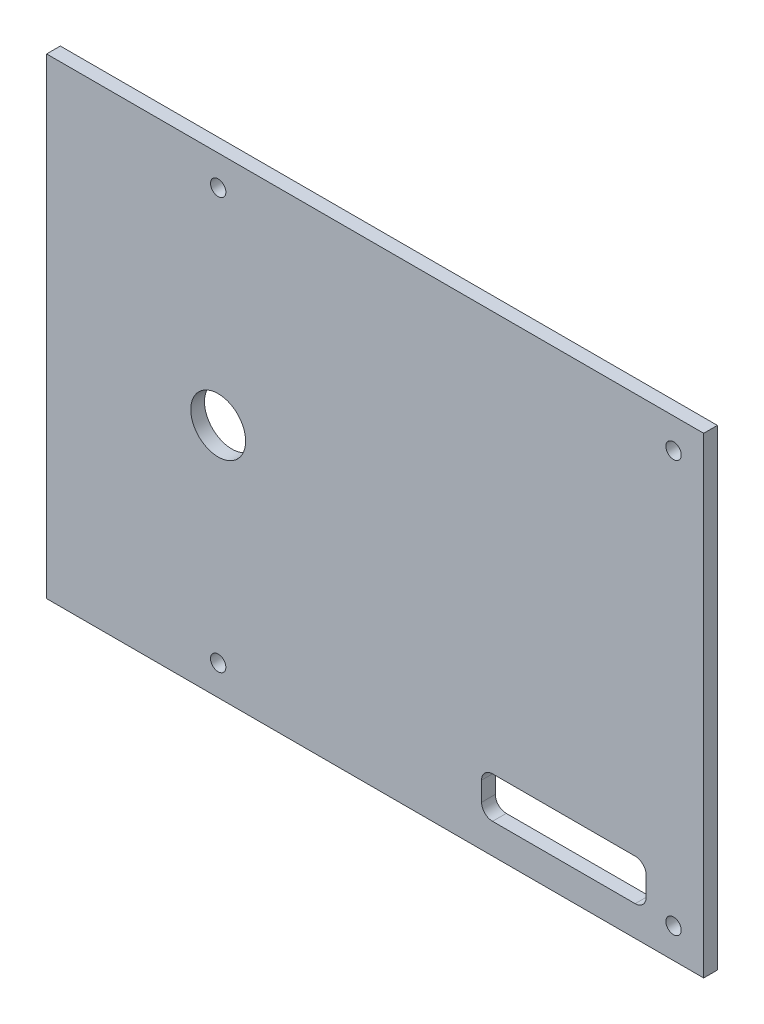
ISO-10303-21;
HEADER;
FILE_DESCRIPTION(('STEP AP214'),'2;1');
FILE_NAME('part.step','',(''),(''),'','','');
FILE_SCHEMA(('AUTOMOTIVE_DESIGN { 1 0 10303 214 1 1 1 1 }'));
ENDSEC;
DATA;
#1=APPLICATION_CONTEXT('core data for automotive mechanical design processes');
#2=APPLICATION_PROTOCOL_DEFINITION('international standard','automotive_design',2000,#1);
#3=PRODUCT_CONTEXT('',#1,'mechanical');
#4=PRODUCT('Part','Part','',(#3));
#5=PRODUCT_RELATED_PRODUCT_CATEGORY('part','',(#4));
#6=PRODUCT_DEFINITION_FORMATION('','',#4);
#7=PRODUCT_DEFINITION_CONTEXT('part definition',#1,'design');
#8=PRODUCT_DEFINITION('design','',#6,#7);
#9=PRODUCT_DEFINITION_SHAPE('','',#8);
#10=(LENGTH_UNIT() NAMED_UNIT(*) SI_UNIT(.MILLI.,.METRE.));
#11=(NAMED_UNIT(*) PLANE_ANGLE_UNIT() SI_UNIT($,.RADIAN.));
#12=(NAMED_UNIT(*) SI_UNIT($,.STERADIAN.) SOLID_ANGLE_UNIT());
#13=UNCERTAINTY_MEASURE_WITH_UNIT(LENGTH_MEASURE(1.E-05),#10,'distance_accuracy_value','');
#14=(GEOMETRIC_REPRESENTATION_CONTEXT(3) GLOBAL_UNCERTAINTY_ASSIGNED_CONTEXT((#13)) GLOBAL_UNIT_ASSIGNED_CONTEXT((#10,
#11,#12)) REPRESENTATION_CONTEXT('',''));
#15=CARTESIAN_POINT('',(0.,0.,0.));
#16=DIRECTION('',(0.,0.,1.));
#17=DIRECTION('',(1.,0.,0.));
#18=AXIS2_PLACEMENT_3D('',#15,#16,#17);
#19=CARTESIAN_POINT('',(-14.7875,54.61,3.175));
#20=DIRECTION('',(0.,1.,0.));
#21=DIRECTION('',(0.,0.,1.));
#22=AXIS2_PLACEMENT_3D('',#19,#20,#21);
#23=PLANE('',#22);
#24=DIRECTION('',(1.,0.,0.));
#25=VECTOR('',#24,1.);
#26=CARTESIAN_POINT('',(-14.7875,54.61,0.));
#27=LINE('',#26,#25);
#28=CARTESIAN_POINT('',(-92.44,54.61,0.));
#29=VERTEX_POINT('',#28);
#30=CARTESIAN_POINT('',(59.69,54.61,0.));
#31=VERTEX_POINT('',#30);
#32=EDGE_CURVE('E136',#29,#31,#27,.T.);
#33=ORIENTED_EDGE('',*,*,#32,.F.);
#34=DIRECTION('',(0.,0.,-1.));
#35=VECTOR('',#34,1.);
#36=CARTESIAN_POINT('',(-92.44,54.61,0.));
#37=LINE('',#36,#35);
#38=CARTESIAN_POINT('',(-92.44,54.61,3.175));
#39=VERTEX_POINT('',#38);
#40=EDGE_CURVE('E151',#39,#29,#37,.T.);
#41=ORIENTED_EDGE('',*,*,#40,.F.);
#42=DIRECTION('',(1.,0.,0.));
#43=VECTOR('',#42,1.);
#44=CARTESIAN_POINT('',(-14.7875,54.61,3.175));
#45=LINE('',#44,#43);
#46=CARTESIAN_POINT('',(59.69,54.61,3.175));
#47=VERTEX_POINT('',#46);
#48=EDGE_CURVE('E187',#39,#47,#45,.T.);
#49=ORIENTED_EDGE('',*,*,#48,.T.);
#50=DIRECTION('',(0.,0.,-1.));
#51=VECTOR('',#50,1.);
#52=CARTESIAN_POINT('',(59.69,54.61,3.175));
#53=LINE('',#52,#51);
#54=EDGE_CURVE('E203',#47,#31,#53,.T.);
#55=ORIENTED_EDGE('',*,*,#54,.T.);
#56=EDGE_LOOP('',(#33,#41,#49,#55));
#57=FACE_BOUND('',#56,.T.);
#58=ADVANCED_FACE('F35',(#57),#23,.T.);
#59=CARTESIAN_POINT('',(-14.7875,-54.61,3.175));
#60=DIRECTION('',(0.,-1.,0.));
#61=DIRECTION('',(0.,0.,-1.));
#62=AXIS2_PLACEMENT_3D('',#59,#60,#61);
#63=PLANE('',#62);
#64=DIRECTION('',(-1.,0.,0.));
#65=VECTOR('',#64,1.);
#66=CARTESIAN_POINT('',(-14.7875,-54.61,0.));
#67=LINE('',#66,#65);
#68=CARTESIAN_POINT('',(59.69,-54.61,0.));
#69=VERTEX_POINT('',#68);
#70=CARTESIAN_POINT('',(-92.44,-54.61,0.));
#71=VERTEX_POINT('',#70);
#72=EDGE_CURVE('E126',#69,#71,#67,.T.);
#73=ORIENTED_EDGE('',*,*,#72,.F.);
#74=DIRECTION('',(0.,0.,-1.));
#75=VECTOR('',#74,1.);
#76=CARTESIAN_POINT('',(59.69,-54.61,3.175));
#77=LINE('',#76,#75);
#78=CARTESIAN_POINT('',(59.69,-54.61,3.175));
#79=VERTEX_POINT('',#78);
#80=EDGE_CURVE('E217',#79,#69,#77,.T.);
#81=ORIENTED_EDGE('',*,*,#80,.F.);
#82=DIRECTION('',(-1.,0.,0.));
#83=VECTOR('',#82,1.);
#84=CARTESIAN_POINT('',(-14.7875,-54.61,3.175));
#85=LINE('',#84,#83);
#86=CARTESIAN_POINT('',(-92.44,-54.61,3.175));
#87=VERTEX_POINT('',#86);
#88=EDGE_CURVE('E142',#79,#87,#85,.T.);
#89=ORIENTED_EDGE('',*,*,#88,.T.);
#90=DIRECTION('',(0.,0.,1.));
#91=VECTOR('',#90,1.);
#92=CARTESIAN_POINT('',(-92.44,-54.61,0.));
#93=LINE('',#92,#91);
#94=EDGE_CURVE('E139',#71,#87,#93,.T.);
#95=ORIENTED_EDGE('',*,*,#94,.F.);
#96=EDGE_LOOP('',(#73,#81,#89,#95));
#97=FACE_BOUND('',#96,.T.);
#98=ADVANCED_FACE('F140',(#97),#63,.T.);
#99=CARTESIAN_POINT('',(52.715,47.6350000000001,3.175));
#100=DIRECTION('',(0.,0.,-1.));
#101=DIRECTION('',(-1.,0.,0.));
#102=AXIS2_PLACEMENT_3D('',#99,#100,#101);
#103=CYLINDRICAL_SURFACE('',#102,1.77800000000001);
#104=CARTESIAN_POINT('',(52.715,47.6350000000001,3.175));
#105=DIRECTION('',(0.,0.,1.));
#106=DIRECTION('',(1.,0.,0.));
#107=AXIS2_PLACEMENT_3D('',#104,#105,#106);
#108=CIRCLE('',#107,1.77800000000001);
#109=CARTESIAN_POINT('',(54.493,47.6350000000001,3.175));
#110=VERTEX_POINT('',#109);
#111=EDGE_CURVE('E197',#110,#110,#108,.F.);
#112=ORIENTED_EDGE('',*,*,#111,.F.);
#113=EDGE_LOOP('',(#112));
#114=FACE_BOUND('',#113,.T.);
#115=CARTESIAN_POINT('',(52.715,47.6350000000001,0.));
#116=DIRECTION('',(0.,0.,1.));
#117=DIRECTION('',(1.,0.,0.));
#118=AXIS2_PLACEMENT_3D('',#115,#116,#117);
#119=CIRCLE('',#118,1.77800000000001);
#120=CARTESIAN_POINT('',(54.493,47.6350000000001,0.));
#121=VERTEX_POINT('',#120);
#122=EDGE_CURVE('E211',#121,#121,#119,.F.);
#123=ORIENTED_EDGE('',*,*,#122,.T.);
#124=EDGE_LOOP('',(#123));
#125=FACE_BOUND('',#124,.T.);
#126=ADVANCED_FACE('F297',(#114,#125),#103,.F.);
#127=CARTESIAN_POINT('',(52.715,-47.6350000000001,3.175));
#128=DIRECTION('',(0.,0.,-1.));
#129=DIRECTION('',(-1.,0.,0.));
#130=AXIS2_PLACEMENT_3D('',#127,#128,#129);
#131=CYLINDRICAL_SURFACE('',#130,1.77800000000001);
#132=CARTESIAN_POINT('',(52.715,-47.6350000000001,3.175));
#133=DIRECTION('',(0.,0.,1.));
#134=DIRECTION('',(1.,0.,0.));
#135=AXIS2_PLACEMENT_3D('',#132,#133,#134);
#136=CIRCLE('',#135,1.77800000000001);
#137=CARTESIAN_POINT('',(54.493,-47.6350000000001,3.175));
#138=VERTEX_POINT('',#137);
#139=EDGE_CURVE('E194',#138,#138,#136,.T.);
#140=ORIENTED_EDGE('',*,*,#139,.T.);
#141=EDGE_LOOP('',(#140));
#142=FACE_BOUND('',#141,.T.);
#143=CARTESIAN_POINT('',(52.715,-47.6350000000001,0.));
#144=DIRECTION('',(0.,0.,1.));
#145=DIRECTION('',(1.,0.,0.));
#146=AXIS2_PLACEMENT_3D('',#143,#144,#145);
#147=CIRCLE('',#146,1.77800000000001);
#148=CARTESIAN_POINT('',(54.493,-47.6350000000001,0.));
#149=VERTEX_POINT('',#148);
#150=EDGE_CURVE('E208',#149,#149,#147,.T.);
#151=ORIENTED_EDGE('',*,*,#150,.F.);
#152=EDGE_LOOP('',(#151));
#153=FACE_BOUND('',#152,.T.);
#154=ADVANCED_FACE('F331',(#142,#153),#131,.F.);
#155=CARTESIAN_POINT('',(59.69,-143.809592003479,3.175));
#156=DIRECTION('',(-1.,0.,0.));
#157=DIRECTION('',(0.,0.,1.));
#158=AXIS2_PLACEMENT_3D('',#155,#156,#157);
#159=PLANE('',#158);
#160=DIRECTION('',(0.,1.,0.));
#161=VECTOR('',#160,1.);
#162=CARTESIAN_POINT('',(59.69,-143.809592003479,0.));
#163=LINE('',#162,#161);
#164=EDGE_CURVE('E134',#69,#31,#163,.T.);
#165=ORIENTED_EDGE('',*,*,#164,.T.);
#166=ORIENTED_EDGE('',*,*,#54,.F.);
#167=DIRECTION('',(0.,1.,0.));
#168=VECTOR('',#167,1.);
#169=CARTESIAN_POINT('',(59.69,-143.809592003479,3.175));
#170=LINE('',#169,#168);
#171=EDGE_CURVE('E192',#79,#47,#170,.T.);
#172=ORIENTED_EDGE('',*,*,#171,.F.);
#173=ORIENTED_EDGE('',*,*,#80,.T.);
#174=EDGE_LOOP('',(#165,#166,#172,#173));
#175=FACE_BOUND('',#174,.T.);
#176=ADVANCED_FACE('F305',(#175),#159,.F.);
#177=CARTESIAN_POINT('',(-52.715,47.635,3.175));
#178=DIRECTION('',(0.,0.,-1.));
#179=DIRECTION('',(-1.,0.,0.));
#180=AXIS2_PLACEMENT_3D('',#177,#178,#179);
#181=CYLINDRICAL_SURFACE('',#180,1.778);
#182=CARTESIAN_POINT('',(-52.715,47.635,3.175));
#183=DIRECTION('',(0.,0.,1.));
#184=DIRECTION('',(1.,0.,0.));
#185=AXIS2_PLACEMENT_3D('',#182,#183,#184);
#186=CIRCLE('',#185,1.778);
#187=CARTESIAN_POINT('',(-50.937,47.635,3.175));
#188=VERTEX_POINT('',#187);
#189=EDGE_CURVE('E184',#188,#188,#186,.T.);
#190=ORIENTED_EDGE('',*,*,#189,.T.);
#191=EDGE_LOOP('',(#190));
#192=FACE_BOUND('',#191,.T.);
#193=CARTESIAN_POINT('',(-52.715,47.635,0.));
#194=DIRECTION('',(0.,0.,1.));
#195=DIRECTION('',(1.,0.,0.));
#196=AXIS2_PLACEMENT_3D('',#193,#194,#195);
#197=CIRCLE('',#196,1.778);
#198=CARTESIAN_POINT('',(-50.937,47.635,0.));
#199=VERTEX_POINT('',#198);
#200=EDGE_CURVE('E174',#199,#199,#197,.T.);
#201=ORIENTED_EDGE('',*,*,#200,.F.);
#202=EDGE_LOOP('',(#201));
#203=FACE_BOUND('',#202,.T.);
#204=ADVANCED_FACE('F301',(#192,#203),#181,.F.);
#205=CARTESIAN_POINT('',(-52.715,-47.635,3.175));
#206=DIRECTION('',(0.,0.,-1.));
#207=DIRECTION('',(-1.,0.,0.));
#208=AXIS2_PLACEMENT_3D('',#205,#206,#207);
#209=CYLINDRICAL_SURFACE('',#208,1.778);
#210=CARTESIAN_POINT('',(-52.715,-47.635,3.175));
#211=DIRECTION('',(0.,0.,1.));
#212=DIRECTION('',(1.,0.,0.));
#213=AXIS2_PLACEMENT_3D('',#210,#211,#212);
#214=CIRCLE('',#213,1.778);
#215=CARTESIAN_POINT('',(-50.937,-47.635,3.175));
#216=VERTEX_POINT('',#215);
#217=EDGE_CURVE('E200',#216,#216,#214,.F.);
#218=ORIENTED_EDGE('',*,*,#217,.F.);
#219=EDGE_LOOP('',(#218));
#220=FACE_BOUND('',#219,.T.);
#221=CARTESIAN_POINT('',(-52.715,-47.635,0.));
#222=DIRECTION('',(0.,0.,1.));
#223=DIRECTION('',(1.,0.,0.));
#224=AXIS2_PLACEMENT_3D('',#221,#222,#223);
#225=CIRCLE('',#224,1.778);
#226=CARTESIAN_POINT('',(-50.937,-47.635,0.));
#227=VERTEX_POINT('',#226);
#228=EDGE_CURVE('E188',#227,#227,#225,.F.);
#229=ORIENTED_EDGE('',*,*,#228,.T.);
#230=EDGE_LOOP('',(#229));
#231=FACE_BOUND('',#230,.T.);
#232=ADVANCED_FACE('F304',(#220,#231),#209,.F.);
#233=CARTESIAN_POINT('',(-14.7875,-143.809592003479,3.175));
#234=DIRECTION('',(0.,0.,1.));
#235=DIRECTION('',(1.,0.,0.));
#236=AXIS2_PLACEMENT_3D('',#233,#234,#235);
#237=PLANE('',#236);
#238=CARTESIAN_POINT('',(-52.715,0.,3.175));
#239=DIRECTION('',(0.,0.,1.));
#240=DIRECTION('',(1.,0.,0.));
#241=AXIS2_PLACEMENT_3D('',#238,#239,#240);
#242=CIRCLE('',#241,6.35);
#243=CARTESIAN_POINT('',(-46.365,0.,3.175));
#244=VERTEX_POINT('',#243);
#245=EDGE_CURVE('E156',#244,#244,#242,.T.);
#246=ORIENTED_EDGE('',*,*,#245,.F.);
#247=EDGE_LOOP('',(#246));
#248=FACE_BOUND('',#247,.T.);
#249=DIRECTION('',(1.,0.,0.));
#250=VECTOR('',#249,1.);
#251=CARTESIAN_POINT('',(8.265,-47.6350000000001,3.175));
#252=LINE('',#251,#250);
#253=CARTESIAN_POINT('',(10.805,-47.6350000000001,3.175));
#254=VERTEX_POINT('',#253);
#255=CARTESIAN_POINT('',(43.825,-47.6350000000001,3.175));
#256=VERTEX_POINT('',#255);
#257=EDGE_CURVE('E160',#254,#256,#252,.T.);
#258=ORIENTED_EDGE('',*,*,#257,.F.);
#259=CARTESIAN_POINT('',(10.805,-45.0950000000001,3.175));
#260=DIRECTION('',(0.,0.,1.));
#261=DIRECTION('',(1.,0.,0.));
#262=AXIS2_PLACEMENT_3D('',#259,#260,#261);
#263=CIRCLE('',#262,2.54);
#264=CARTESIAN_POINT('',(8.265,-45.0950000000001,3.175));
#265=VERTEX_POINT('',#264);
#266=EDGE_CURVE('E43',#254,#265,#263,.F.);
#267=ORIENTED_EDGE('',*,*,#266,.T.);
#268=DIRECTION('',(0.,-1.,0.));
#269=VECTOR('',#268,1.);
#270=CARTESIAN_POINT('',(8.26499999999999,-38.109999999999,3.175));
#271=LINE('',#270,#269);
#272=CARTESIAN_POINT('',(8.26499999999999,-40.649999999999,3.175));
#273=VERTEX_POINT('',#272);
#274=EDGE_CURVE('E167',#273,#265,#271,.T.);
#275=ORIENTED_EDGE('',*,*,#274,.F.);
#276=CARTESIAN_POINT('',(10.805,-40.649999999999,3.175));
#277=DIRECTION('',(0.,0.,1.));
#278=DIRECTION('',(1.,0.,0.));
#279=AXIS2_PLACEMENT_3D('',#276,#277,#278);
#280=CIRCLE('',#279,2.54);
#281=CARTESIAN_POINT('',(10.805,-38.109999999999,3.175));
#282=VERTEX_POINT('',#281);
#283=EDGE_CURVE('E246',#273,#282,#280,.F.);
#284=ORIENTED_EDGE('',*,*,#283,.T.);
#285=DIRECTION('',(-1.,0.,0.));
#286=VECTOR('',#285,1.);
#287=CARTESIAN_POINT('',(46.365,-38.109999999999,3.175));
#288=LINE('',#287,#286);
#289=CARTESIAN_POINT('',(43.825,-38.109999999999,3.175));
#290=VERTEX_POINT('',#289);
#291=EDGE_CURVE('E180',#290,#282,#288,.T.);
#292=ORIENTED_EDGE('',*,*,#291,.F.);
#293=CARTESIAN_POINT('',(43.825,-40.649999999999,3.175));
#294=DIRECTION('',(0.,0.,1.));
#295=DIRECTION('',(1.,0.,0.));
#296=AXIS2_PLACEMENT_3D('',#293,#294,#295);
#297=CIRCLE('',#296,2.54);
#298=CARTESIAN_POINT('',(46.365,-40.649999999999,3.175));
#299=VERTEX_POINT('',#298);
#300=EDGE_CURVE('E242',#290,#299,#297,.F.);
#301=ORIENTED_EDGE('',*,*,#300,.T.);
#302=DIRECTION('',(0.,1.,0.));
#303=VECTOR('',#302,1.);
#304=CARTESIAN_POINT('',(46.365,-47.6350000000001,3.175));
#305=LINE('',#304,#303);
#306=CARTESIAN_POINT('',(46.365,-45.0950000000001,3.175));
#307=VERTEX_POINT('',#306);
#308=EDGE_CURVE('E177',#307,#299,#305,.T.);
#309=ORIENTED_EDGE('',*,*,#308,.F.);
#310=CARTESIAN_POINT('',(43.825,-45.0950000000001,3.175));
#311=DIRECTION('',(0.,0.,1.));
#312=DIRECTION('',(1.,0.,0.));
#313=AXIS2_PLACEMENT_3D('',#310,#311,#312);
#314=CIRCLE('',#313,2.54);
#315=EDGE_CURVE('E238',#307,#256,#314,.F.);
#316=ORIENTED_EDGE('',*,*,#315,.T.);
#317=EDGE_LOOP('',(#258,#267,#275,#284,#292,#301,#309,#316));
#318=FACE_BOUND('',#317,.T.);
#319=ORIENTED_EDGE('',*,*,#189,.F.);
#320=EDGE_LOOP('',(#319));
#321=FACE_BOUND('',#320,.T.);
#322=ORIENTED_EDGE('',*,*,#48,.F.);
#323=DIRECTION('',(0.,1.,0.));
#324=VECTOR('',#323,1.);
#325=CARTESIAN_POINT('',(-92.44,54.61,3.175));
#326=LINE('',#325,#324);
#327=EDGE_CURVE('E146',#87,#39,#326,.T.);
#328=ORIENTED_EDGE('',*,*,#327,.F.);
#329=ORIENTED_EDGE('',*,*,#88,.F.);
#330=ORIENTED_EDGE('',*,*,#171,.T.);
#331=EDGE_LOOP('',(#322,#328,#329,#330));
#332=FACE_BOUND('',#331,.T.);
#333=ORIENTED_EDGE('',*,*,#139,.F.);
#334=EDGE_LOOP('',(#333));
#335=FACE_BOUND('',#334,.T.);
#336=ORIENTED_EDGE('',*,*,#111,.T.);
#337=EDGE_LOOP('',(#336));
#338=FACE_BOUND('',#337,.T.);
#339=ORIENTED_EDGE('',*,*,#217,.T.);
#340=EDGE_LOOP('',(#339));
#341=FACE_BOUND('',#340,.T.);
#342=ADVANCED_FACE('F251',(#248,#318,#321,#332,#335,#338,#341),#237,.T.);
#343=CARTESIAN_POINT('',(-14.7875,-143.809592003479,0.));
#344=DIRECTION('',(0.,0.,1.));
#345=DIRECTION('',(1.,0.,0.));
#346=AXIS2_PLACEMENT_3D('',#343,#344,#345);
#347=PLANE('',#346);
#348=CARTESIAN_POINT('',(-52.715,0.,0.));
#349=DIRECTION('',(0.,0.,1.));
#350=DIRECTION('',(1.,0.,0.));
#351=AXIS2_PLACEMENT_3D('',#348,#349,#350);
#352=CIRCLE('',#351,6.35);
#353=CARTESIAN_POINT('',(-46.365,0.,0.));
#354=VERTEX_POINT('',#353);
#355=EDGE_CURVE('E157',#354,#354,#352,.T.);
#356=ORIENTED_EDGE('',*,*,#355,.T.);
#357=EDGE_LOOP('',(#356));
#358=FACE_BOUND('',#357,.T.);
#359=DIRECTION('',(-1.,0.,0.));
#360=VECTOR('',#359,1.);
#361=CARTESIAN_POINT('',(46.365,-38.109999999999,0.));
#362=LINE('',#361,#360);
#363=CARTESIAN_POINT('',(43.825,-38.109999999999,0.));
#364=VERTEX_POINT('',#363);
#365=CARTESIAN_POINT('',(10.805,-38.109999999999,0.));
#366=VERTEX_POINT('',#365);
#367=EDGE_CURVE('E170',#364,#366,#362,.T.);
#368=ORIENTED_EDGE('',*,*,#367,.T.);
#369=CARTESIAN_POINT('',(10.805,-40.649999999999,0.));
#370=DIRECTION('',(0.,0.,1.));
#371=DIRECTION('',(1.,0.,0.));
#372=AXIS2_PLACEMENT_3D('',#369,#370,#371);
#373=CIRCLE('',#372,2.54);
#374=CARTESIAN_POINT('',(8.26499999999999,-40.649999999999,0.));
#375=VERTEX_POINT('',#374);
#376=EDGE_CURVE('E57',#366,#375,#373,.T.);
#377=ORIENTED_EDGE('',*,*,#376,.T.);
#378=DIRECTION('',(0.,-1.,0.));
#379=VECTOR('',#378,1.);
#380=CARTESIAN_POINT('',(8.26499999999999,-38.109999999999,0.));
#381=LINE('',#380,#379);
#382=CARTESIAN_POINT('',(8.265,-45.0950000000001,0.));
#383=VERTEX_POINT('',#382);
#384=EDGE_CURVE('E172',#375,#383,#381,.T.);
#385=ORIENTED_EDGE('',*,*,#384,.T.);
#386=CARTESIAN_POINT('',(10.805,-45.0950000000001,0.));
#387=DIRECTION('',(0.,0.,1.));
#388=DIRECTION('',(1.,0.,0.));
#389=AXIS2_PLACEMENT_3D('',#386,#387,#388);
#390=CIRCLE('',#389,2.54);
#391=CARTESIAN_POINT('',(10.805,-47.6350000000001,0.));
#392=VERTEX_POINT('',#391);
#393=EDGE_CURVE('E11',#383,#392,#390,.T.);
#394=ORIENTED_EDGE('',*,*,#393,.T.);
#395=DIRECTION('',(1.,0.,0.));
#396=VECTOR('',#395,1.);
#397=CARTESIAN_POINT('',(8.265,-47.6350000000001,0.));
#398=LINE('',#397,#396);
#399=CARTESIAN_POINT('',(43.825,-47.6350000000001,0.));
#400=VERTEX_POINT('',#399);
#401=EDGE_CURVE('E163',#392,#400,#398,.T.);
#402=ORIENTED_EDGE('',*,*,#401,.T.);
#403=CARTESIAN_POINT('',(43.825,-45.0950000000001,0.));
#404=DIRECTION('',(0.,0.,1.));
#405=DIRECTION('',(1.,0.,0.));
#406=AXIS2_PLACEMENT_3D('',#403,#404,#405);
#407=CIRCLE('',#406,2.54);
#408=CARTESIAN_POINT('',(46.365,-45.0950000000001,0.));
#409=VERTEX_POINT('',#408);
#410=EDGE_CURVE('E240',#400,#409,#407,.T.);
#411=ORIENTED_EDGE('',*,*,#410,.T.);
#412=DIRECTION('',(0.,1.,0.));
#413=VECTOR('',#412,1.);
#414=CARTESIAN_POINT('',(46.365,-47.6350000000001,0.));
#415=LINE('',#414,#413);
#416=CARTESIAN_POINT('',(46.365,-40.649999999999,0.));
#417=VERTEX_POINT('',#416);
#418=EDGE_CURVE('E166',#409,#417,#415,.T.);
#419=ORIENTED_EDGE('',*,*,#418,.T.);
#420=CARTESIAN_POINT('',(43.825,-40.649999999999,0.));
#421=DIRECTION('',(0.,0.,1.));
#422=DIRECTION('',(1.,0.,0.));
#423=AXIS2_PLACEMENT_3D('',#420,#421,#422);
#424=CIRCLE('',#423,2.54);
#425=EDGE_CURVE('E244',#417,#364,#424,.T.);
#426=ORIENTED_EDGE('',*,*,#425,.T.);
#427=EDGE_LOOP('',(#368,#377,#385,#394,#402,#411,#419,#426));
#428=FACE_BOUND('',#427,.T.);
#429=ORIENTED_EDGE('',*,*,#200,.T.);
#430=EDGE_LOOP('',(#429));
#431=FACE_BOUND('',#430,.T.);
#432=ORIENTED_EDGE('',*,*,#32,.T.);
#433=ORIENTED_EDGE('',*,*,#164,.F.);
#434=ORIENTED_EDGE('',*,*,#72,.T.);
#435=DIRECTION('',(0.,-1.,0.));
#436=VECTOR('',#435,1.);
#437=CARTESIAN_POINT('',(-92.44,54.61,0.));
#438=LINE('',#437,#436);
#439=EDGE_CURVE('E132',#29,#71,#438,.T.);
#440=ORIENTED_EDGE('',*,*,#439,.F.);
#441=EDGE_LOOP('',(#432,#433,#434,#440));
#442=FACE_BOUND('',#441,.T.);
#443=ORIENTED_EDGE('',*,*,#150,.T.);
#444=EDGE_LOOP('',(#443));
#445=FACE_BOUND('',#444,.T.);
#446=ORIENTED_EDGE('',*,*,#122,.F.);
#447=EDGE_LOOP('',(#446));
#448=FACE_BOUND('',#447,.T.);
#449=ORIENTED_EDGE('',*,*,#228,.F.);
#450=EDGE_LOOP('',(#449));
#451=FACE_BOUND('',#450,.T.);
#452=ADVANCED_FACE('F129',(#358,#428,#431,#442,#445,#448,#451),#347,.F.);
#453=CARTESIAN_POINT('',(8.265,-47.6350000000001,0.));
#454=DIRECTION('',(0.,-1.,0.));
#455=DIRECTION('',(0.,0.,-1.));
#456=AXIS2_PLACEMENT_3D('',#453,#454,#455);
#457=PLANE('',#456);
#458=ORIENTED_EDGE('',*,*,#257,.T.);
#459=DIRECTION('',(0.,0.,1.));
#460=VECTOR('',#459,1.);
#461=CARTESIAN_POINT('',(43.825,-47.6350000000001,0.));
#462=LINE('',#461,#460);
#463=EDGE_CURVE('E227',#256,#400,#462,.F.);
#464=ORIENTED_EDGE('',*,*,#463,.T.);
#465=ORIENTED_EDGE('',*,*,#401,.F.);
#466=DIRECTION('',(0.,0.,1.));
#467=VECTOR('',#466,1.);
#468=CARTESIAN_POINT('',(10.805,-47.6350000000001,3.175));
#469=LINE('',#468,#467);
#470=EDGE_CURVE('E224',#392,#254,#469,.T.);
#471=ORIENTED_EDGE('',*,*,#470,.T.);
#472=EDGE_LOOP('',(#458,#464,#465,#471));
#473=FACE_BOUND('',#472,.T.);
#474=ADVANCED_FACE('F262',(#473),#457,.F.);
#475=CARTESIAN_POINT('',(8.26499999999999,-38.109999999999,0.));
#476=DIRECTION('',(-1.,0.,0.));
#477=DIRECTION('',(0.,-1.,0.));
#478=AXIS2_PLACEMENT_3D('',#475,#476,#477);
#479=PLANE('',#478);
#480=ORIENTED_EDGE('',*,*,#384,.F.);
#481=DIRECTION('',(0.,0.,1.));
#482=VECTOR('',#481,1.);
#483=CARTESIAN_POINT('',(8.26499999999999,-40.649999999999,3.175));
#484=LINE('',#483,#482);
#485=EDGE_CURVE('E235',#375,#273,#484,.T.);
#486=ORIENTED_EDGE('',*,*,#485,.T.);
#487=ORIENTED_EDGE('',*,*,#274,.T.);
#488=DIRECTION('',(0.,0.,1.));
#489=VECTOR('',#488,1.);
#490=CARTESIAN_POINT('',(8.265,-45.0950000000001,0.));
#491=LINE('',#490,#489);
#492=EDGE_CURVE('E50',#265,#383,#491,.F.);
#493=ORIENTED_EDGE('',*,*,#492,.T.);
#494=EDGE_LOOP('',(#480,#486,#487,#493));
#495=FACE_BOUND('',#494,.T.);
#496=ADVANCED_FACE('F255',(#495),#479,.F.);
#497=CARTESIAN_POINT('',(46.365,-38.109999999999,0.));
#498=DIRECTION('',(0.,1.,0.));
#499=DIRECTION('',(-1.,0.,0.));
#500=AXIS2_PLACEMENT_3D('',#497,#498,#499);
#501=PLANE('',#500);
#502=ORIENTED_EDGE('',*,*,#367,.F.);
#503=DIRECTION('',(0.,0.,1.));
#504=VECTOR('',#503,1.);
#505=CARTESIAN_POINT('',(43.825,-38.109999999999,3.175));
#506=LINE('',#505,#504);
#507=EDGE_CURVE('E231',#364,#290,#506,.T.);
#508=ORIENTED_EDGE('',*,*,#507,.T.);
#509=ORIENTED_EDGE('',*,*,#291,.T.);
#510=DIRECTION('',(0.,0.,1.));
#511=VECTOR('',#510,1.);
#512=CARTESIAN_POINT('',(10.805,-38.109999999999,0.));
#513=LINE('',#512,#511);
#514=EDGE_CURVE('E229',#282,#366,#513,.F.);
#515=ORIENTED_EDGE('',*,*,#514,.T.);
#516=EDGE_LOOP('',(#502,#508,#509,#515));
#517=FACE_BOUND('',#516,.T.);
#518=ADVANCED_FACE('F278',(#517),#501,.F.);
#519=CARTESIAN_POINT('',(46.365,-47.6350000000001,0.));
#520=DIRECTION('',(1.,0.,0.));
#521=DIRECTION('',(0.,0.,-1.));
#522=AXIS2_PLACEMENT_3D('',#519,#520,#521);
#523=PLANE('',#522);
#524=ORIENTED_EDGE('',*,*,#418,.F.);
#525=DIRECTION('',(0.,0.,1.));
#526=VECTOR('',#525,1.);
#527=CARTESIAN_POINT('',(46.365,-45.0950000000001,3.175));
#528=LINE('',#527,#526);
#529=EDGE_CURVE('E221',#409,#307,#528,.T.);
#530=ORIENTED_EDGE('',*,*,#529,.T.);
#531=ORIENTED_EDGE('',*,*,#308,.T.);
#532=DIRECTION('',(0.,0.,1.));
#533=VECTOR('',#532,1.);
#534=CARTESIAN_POINT('',(46.365,-40.649999999999,0.));
#535=LINE('',#534,#533);
#536=EDGE_CURVE('E219',#299,#417,#535,.F.);
#537=ORIENTED_EDGE('',*,*,#536,.T.);
#538=EDGE_LOOP('',(#524,#530,#531,#537));
#539=FACE_BOUND('',#538,.T.);
#540=ADVANCED_FACE('F270',(#539),#523,.F.);
#541=CARTESIAN_POINT('',(43.825,-45.0950000000001,0.));
#542=DIRECTION('',(0.,0.,-1.));
#543=DIRECTION('',(-1.,0.,0.));
#544=AXIS2_PLACEMENT_3D('',#541,#542,#543);
#545=CYLINDRICAL_SURFACE('',#544,2.54);
#546=ORIENTED_EDGE('',*,*,#410,.F.);
#547=ORIENTED_EDGE('',*,*,#463,.F.);
#548=ORIENTED_EDGE('',*,*,#315,.F.);
#549=ORIENTED_EDGE('',*,*,#529,.F.);
#550=EDGE_LOOP('',(#546,#547,#548,#549));
#551=FACE_BOUND('',#550,.T.);
#552=ADVANCED_FACE('F265',(#551),#545,.F.);
#553=CARTESIAN_POINT('',(43.825,-40.649999999999,0.));
#554=DIRECTION('',(0.,0.,-1.));
#555=DIRECTION('',(-1.,0.,0.));
#556=AXIS2_PLACEMENT_3D('',#553,#554,#555);
#557=CYLINDRICAL_SURFACE('',#556,2.54);
#558=ORIENTED_EDGE('',*,*,#425,.F.);
#559=ORIENTED_EDGE('',*,*,#536,.F.);
#560=ORIENTED_EDGE('',*,*,#300,.F.);
#561=ORIENTED_EDGE('',*,*,#507,.F.);
#562=EDGE_LOOP('',(#558,#559,#560,#561));
#563=FACE_BOUND('',#562,.T.);
#564=ADVANCED_FACE('F274',(#563),#557,.F.);
#565=CARTESIAN_POINT('',(10.805,-40.649999999999,0.));
#566=DIRECTION('',(0.,0.,-1.));
#567=DIRECTION('',(-1.,0.,0.));
#568=AXIS2_PLACEMENT_3D('',#565,#566,#567);
#569=CYLINDRICAL_SURFACE('',#568,2.54);
#570=ORIENTED_EDGE('',*,*,#376,.F.);
#571=ORIENTED_EDGE('',*,*,#514,.F.);
#572=ORIENTED_EDGE('',*,*,#283,.F.);
#573=ORIENTED_EDGE('',*,*,#485,.F.);
#574=EDGE_LOOP('',(#570,#571,#572,#573));
#575=FACE_BOUND('',#574,.T.);
#576=ADVANCED_FACE('F282',(#575),#569,.F.);
#577=CARTESIAN_POINT('',(10.805,-45.0950000000001,0.));
#578=DIRECTION('',(0.,0.,-1.));
#579=DIRECTION('',(-1.,0.,0.));
#580=AXIS2_PLACEMENT_3D('',#577,#578,#579);
#581=CYLINDRICAL_SURFACE('',#580,2.54);
#582=ORIENTED_EDGE('',*,*,#393,.F.);
#583=ORIENTED_EDGE('',*,*,#492,.F.);
#584=ORIENTED_EDGE('',*,*,#266,.F.);
#585=ORIENTED_EDGE('',*,*,#470,.F.);
#586=EDGE_LOOP('',(#582,#583,#584,#585));
#587=FACE_BOUND('',#586,.T.);
#588=ADVANCED_FACE('F37',(#587),#581,.F.);
#589=CARTESIAN_POINT('',(-52.715,0.,0.));
#590=DIRECTION('',(0.,0.,1.));
#591=DIRECTION('',(1.,0.,0.));
#592=AXIS2_PLACEMENT_3D('',#589,#590,#591);
#593=CYLINDRICAL_SURFACE('',#592,6.35);
#594=ORIENTED_EDGE('',*,*,#355,.F.);
#595=EDGE_LOOP('',(#594));
#596=FACE_BOUND('',#595,.T.);
#597=ORIENTED_EDGE('',*,*,#245,.T.);
#598=EDGE_LOOP('',(#597));
#599=FACE_BOUND('',#598,.T.);
#600=ADVANCED_FACE('F288',(#596,#599),#593,.F.);
#601=CARTESIAN_POINT('',(-92.44,-54.61,0.));
#602=DIRECTION('',(-1.,0.,0.));
#603=DIRECTION('',(0.,0.,1.));
#604=AXIS2_PLACEMENT_3D('',#601,#602,#603);
#605=PLANE('',#604);
#606=ORIENTED_EDGE('',*,*,#439,.T.);
#607=ORIENTED_EDGE('',*,*,#94,.T.);
#608=ORIENTED_EDGE('',*,*,#327,.T.);
#609=ORIENTED_EDGE('',*,*,#40,.T.);
#610=EDGE_LOOP('',(#606,#607,#608,#609));
#611=FACE_BOUND('',#610,.T.);
#612=ADVANCED_FACE('F149',(#611),#605,.T.);
#613=CLOSED_SHELL('',(#58,#98,#126,#154,#176,#204,#232,#342,#452,#474,#496,#518,#540,#552,#564,
#576,#588,#600,#612));
#614=MANIFOLD_SOLID_BREP('B2',#613);
#615=ADVANCED_BREP_SHAPE_REPRESENTATION('',(#18,#614),#14);
#616=SHAPE_DEFINITION_REPRESENTATION(#9,#615);
ENDSEC;
END-ISO-10303-21;
